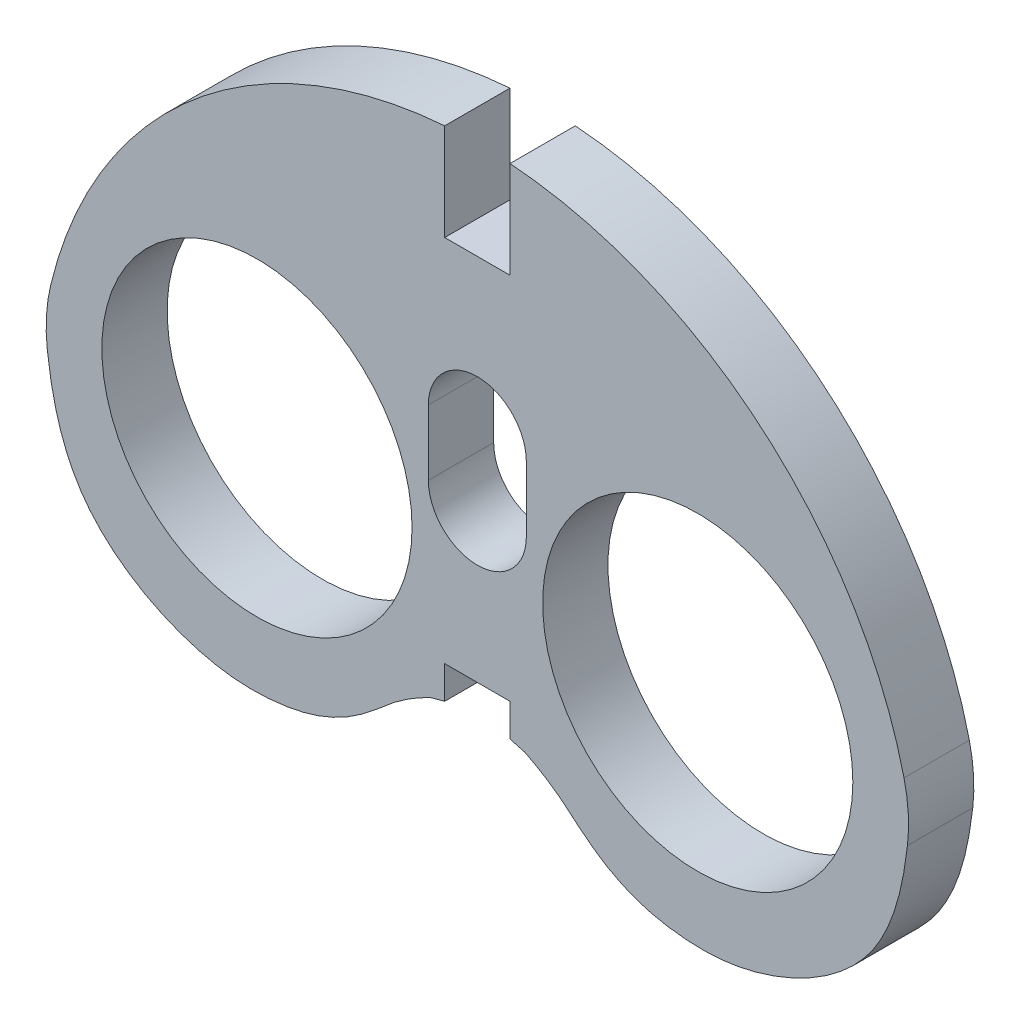
ISO-10303-21;
HEADER;
FILE_DESCRIPTION(('STEP AP214'),'2;1');
FILE_NAME('part.step','',(''),(''),'','','');
FILE_SCHEMA(('AUTOMOTIVE_DESIGN { 1 0 10303 214 1 1 1 1 }'));
ENDSEC;
DATA;
#1=APPLICATION_CONTEXT('core data for automotive mechanical design processes');
#2=APPLICATION_PROTOCOL_DEFINITION('international standard','automotive_design',2000,#1);
#3=PRODUCT_CONTEXT('',#1,'mechanical');
#4=PRODUCT('Part','Part','',(#3));
#5=PRODUCT_RELATED_PRODUCT_CATEGORY('part','',(#4));
#6=PRODUCT_DEFINITION_FORMATION('','',#4);
#7=PRODUCT_DEFINITION_CONTEXT('part definition',#1,'design');
#8=PRODUCT_DEFINITION('design','',#6,#7);
#9=PRODUCT_DEFINITION_SHAPE('','',#8);
#10=(LENGTH_UNIT() NAMED_UNIT(*) SI_UNIT(.MILLI.,.METRE.));
#11=(NAMED_UNIT(*) PLANE_ANGLE_UNIT() SI_UNIT($,.RADIAN.));
#12=(NAMED_UNIT(*) SI_UNIT($,.STERADIAN.) SOLID_ANGLE_UNIT());
#13=UNCERTAINTY_MEASURE_WITH_UNIT(LENGTH_MEASURE(1.E-05),#10,'distance_accuracy_value','');
#14=(GEOMETRIC_REPRESENTATION_CONTEXT(3) GLOBAL_UNCERTAINTY_ASSIGNED_CONTEXT((#13)) GLOBAL_UNIT_ASSIGNED_CONTEXT((#10,
#11,#12)) REPRESENTATION_CONTEXT('',''));
#15=CARTESIAN_POINT('',(0.,0.,0.));
#16=DIRECTION('',(0.,0.,1.));
#17=DIRECTION('',(1.,0.,0.));
#18=AXIS2_PLACEMENT_3D('',#15,#16,#17);
#19=CARTESIAN_POINT('',(16.4115654390647,-0.553695702220483,0.));
#20=DIRECTION('',(0.,0.,-1.));
#21=DIRECTION('',(-1.,0.,0.));
#22=AXIS2_PLACEMENT_3D('',#19,#20,#21);
#23=CYLINDRICAL_SURFACE('',#22,10.);
#24=DIRECTION('',(0.,0.,-1.));
#25=VECTOR('',#24,1.);
#26=CARTESIAN_POINT('',(26.345599961166,-1.70041193289809,0.));
#27=LINE('',#26,#25);
#28=CARTESIAN_POINT('',(26.345599961166,-1.70041193289809,0.));
#29=VERTEX_POINT('',#28);
#30=CARTESIAN_POINT('',(26.345599961166,-1.70041193289809,4.));
#31=VERTEX_POINT('',#30);
#32=EDGE_CURVE('E401',#29,#31,#27,.F.);
#33=ORIENTED_EDGE('',*,*,#32,.F.);
#34=CARTESIAN_POINT('',(16.4115654390647,-0.553695702220483,0.));
#35=DIRECTION('',(0.,0.,1.));
#36=DIRECTION('',(1.,0.,0.));
#37=AXIS2_PLACEMENT_3D('',#34,#35,#36);
#38=CIRCLE('',#37,10.);
#39=CARTESIAN_POINT('',(26.1344253879737,1.78425092118676,0.));
#40=VERTEX_POINT('',#39);
#41=EDGE_CURVE('E43',#40,#29,#38,.F.);
#42=ORIENTED_EDGE('',*,*,#41,.F.);
#43=DIRECTION('',(0.,0.,-1.));
#44=VECTOR('',#43,1.);
#45=CARTESIAN_POINT('',(26.1344253879737,1.78425092118674,4.));
#46=LINE('',#45,#44);
#47=CARTESIAN_POINT('',(26.1344253879737,1.78425092118676,4.));
#48=VERTEX_POINT('',#47);
#49=EDGE_CURVE('E404',#48,#40,#46,.T.);
#50=ORIENTED_EDGE('',*,*,#49,.F.);
#51=CARTESIAN_POINT('',(16.4115654390647,-0.553695702220483,4.));
#52=DIRECTION('',(0.,0.,1.));
#53=DIRECTION('',(1.,0.,0.));
#54=AXIS2_PLACEMENT_3D('',#51,#52,#53);
#55=CIRCLE('',#54,10.);
#56=EDGE_CURVE('E11',#31,#48,#55,.T.);
#57=ORIENTED_EDGE('',*,*,#56,.F.);
#58=EDGE_LOOP('',(#33,#42,#50,#57));
#59=FACE_BOUND('',#58,.T.);
#60=ADVANCED_FACE('F36',(#59),#23,.T.);
#61=CARTESIAN_POINT('',(-16.4115558872511,-0.553655979135895,0.));
#62=DIRECTION('',(0.,0.,-1.));
#63=DIRECTION('',(-1.,0.,0.));
#64=AXIS2_PLACEMENT_3D('',#61,#62,#63);
#65=CYLINDRICAL_SURFACE('',#64,10.);
#66=DIRECTION('',(0.,0.,-1.));
#67=VECTOR('',#66,1.);
#68=CARTESIAN_POINT('',(-26.1344101772882,1.78431417779649,4.));
#69=LINE('',#68,#67);
#70=CARTESIAN_POINT('',(-26.1344101772882,1.78431417779653,0.));
#71=VERTEX_POINT('',#70);
#72=CARTESIAN_POINT('',(-26.1344101772882,1.78431417779653,4.));
#73=VERTEX_POINT('',#72);
#74=EDGE_CURVE('E236',#71,#73,#69,.F.);
#75=ORIENTED_EDGE('',*,*,#74,.F.);
#76=CARTESIAN_POINT('',(-16.4115558872511,-0.553655979135895,0.));
#77=DIRECTION('',(0.,0.,1.));
#78=DIRECTION('',(1.,0.,0.));
#79=AXIS2_PLACEMENT_3D('',#76,#77,#78);
#80=CIRCLE('',#79,10.);
#81=CARTESIAN_POINT('',(-26.3455865208138,-1.70040589582995,0.));
#82=VERTEX_POINT('',#81);
#83=EDGE_CURVE('E239',#82,#71,#80,.F.);
#84=ORIENTED_EDGE('',*,*,#83,.F.);
#85=DIRECTION('',(0.,0.,-1.));
#86=VECTOR('',#85,1.);
#87=CARTESIAN_POINT('',(-26.3455865208138,-1.70040589582995,4.));
#88=LINE('',#87,#86);
#89=CARTESIAN_POINT('',(-26.3455865208138,-1.70040589582995,4.));
#90=VERTEX_POINT('',#89);
#91=EDGE_CURVE('E244',#90,#82,#88,.T.);
#92=ORIENTED_EDGE('',*,*,#91,.F.);
#93=CARTESIAN_POINT('',(-16.4115558872511,-0.553655979135895,4.));
#94=DIRECTION('',(0.,0.,1.));
#95=DIRECTION('',(1.,0.,0.));
#96=AXIS2_PLACEMENT_3D('',#93,#94,#95);
#97=CIRCLE('',#96,10.);
#98=EDGE_CURVE('E241',#73,#90,#97,.T.);
#99=ORIENTED_EDGE('',*,*,#98,.F.);
#100=EDGE_LOOP('',(#75,#84,#92,#99));
#101=FACE_BOUND('',#100,.T.);
#102=ADVANCED_FACE('F207',(#101),#65,.T.);
#103=CARTESIAN_POINT('',(-26.5,0.,4.));
#104=CARTESIAN_POINT('',(-26.2895976855222,-2.99847523002595,4.));
#105=CARTESIAN_POINT('',(-25.2189108157834,-9.88188841737187,4.));
#106=CARTESIAN_POINT('',(-17.2017603669986,-13.6180783087082,4.));
#107=CARTESIAN_POINT('',(-10.4279800743529,-13.4303877120603,4.));
#108=CARTESIAN_POINT('',(-7.34675111448135,-12.0113075123866,4.));
#109=CARTESIAN_POINT('',(-4.70959910667379,-9.37857364414358,4.));
#110=CARTESIAN_POINT('',(-2.891538376648,-8.46449967686823,4.));
#111=B_SPLINE_CURVE_WITH_KNOTS('',3,(#103,#104,#105,#106,#107,#108,#109,#110),.UNSPECIFIED.,.F.,
.F.,(4,1,1,1,1,4),(0.,0.254741044057282,0.56319235685487,0.634676404072125,0.898097469012578,
1.),.UNSPECIFIED.);
#112=DIRECTION('',(0.,0.,-1.));
#113=VECTOR('',#112,1.);
#114=SURFACE_OF_LINEAR_EXTRUSION('',#111,#113);
#115=CARTESIAN_POINT('',(-2.89153837346395,-8.46449967584525,4.));
#116=VERTEX_POINT('',#115);
#117=EDGE_CURVE('E188',#90,#116,#111,.T.);
#118=ORIENTED_EDGE('',*,*,#117,.F.);
#119=ORIENTED_EDGE('',*,*,#91,.T.);
#120=CARTESIAN_POINT('',(-26.5,0.,0.));
#121=CARTESIAN_POINT('',(-26.2895976855222,-2.99847523002595,0.));
#122=CARTESIAN_POINT('',(-25.2189108157834,-9.88188841737187,0.));
#123=CARTESIAN_POINT('',(-17.2017603669986,-13.6180783087082,0.));
#124=CARTESIAN_POINT('',(-10.4279800743529,-13.4303877120603,0.));
#125=CARTESIAN_POINT('',(-7.34675111448135,-12.0113075123866,0.));
#126=CARTESIAN_POINT('',(-4.70959910667379,-9.37857364414358,0.));
#127=CARTESIAN_POINT('',(-2.891538376648,-8.46449967686823,0.));
#128=B_SPLINE_CURVE_WITH_KNOTS('',3,(#120,#121,#122,#123,#124,#125,#126,#127),.UNSPECIFIED.,.F.,
.F.,(4,1,1,1,1,4),(0.,0.254741044057282,0.56319235685487,0.634676404072125,0.898097469012578,
1.),.UNSPECIFIED.);
#129=CARTESIAN_POINT('',(-2.89153837346395,-8.46449967584525,0.));
#130=VERTEX_POINT('',#129);
#131=EDGE_CURVE('E289',#82,#130,#128,.T.);
#132=ORIENTED_EDGE('',*,*,#131,.T.);
#133=DIRECTION('',(0.,0.,-1.));
#134=VECTOR('',#133,1.);
#135=CARTESIAN_POINT('',(-2.89153837346395,-8.46449967584525,4.));
#136=LINE('',#135,#134);
#137=EDGE_CURVE('E245',#116,#130,#136,.T.);
#138=ORIENTED_EDGE('',*,*,#137,.F.);
#139=EDGE_LOOP('',(#118,#119,#132,#138));
#140=FACE_BOUND('',#139,.T.);
#141=ADVANCED_FACE('F202',(#140),#114,.F.);
#142=CARTESIAN_POINT('',(-5.99999999999999,-10.,4.));
#143=CARTESIAN_POINT('',(0.,-6.,4.));
#144=CARTESIAN_POINT('',(6.,-9.99999999999999,4.));
#145=B_SPLINE_CURVE_WITH_KNOTS('',2,(#142,#143,#144),.UNSPECIFIED.,.F.,.F.,(3,3),(0.,1.),.UNSPECIFIED.);
#146=DIRECTION('',(0.,0.,-1.));
#147=VECTOR('',#146,1.);
#148=SURFACE_OF_LINEAR_EXTRUSION('',#145,#147);
#149=CARTESIAN_POINT('',(-5.99999999999999,-10.,0.));
#150=CARTESIAN_POINT('',(0.,-6.,0.));
#151=CARTESIAN_POINT('',(6.,-9.99999999999999,0.));
#152=B_SPLINE_CURVE_WITH_KNOTS('',2,(#149,#150,#151),.UNSPECIFIED.,.F.,.F.,(3,3),(0.,1.),.UNSPECIFIED.);
#153=CARTESIAN_POINT('',(-2.,-8.22222222222222,0.));
#154=VERTEX_POINT('',#153);
#155=EDGE_CURVE('E275',#130,#154,#152,.T.);
#156=ORIENTED_EDGE('',*,*,#155,.T.);
#157=DIRECTION('',(0.,0.,-1.));
#158=VECTOR('',#157,1.);
#159=CARTESIAN_POINT('',(-2.,-8.22222222222222,4.));
#160=LINE('',#159,#158);
#161=CARTESIAN_POINT('',(-2.,-8.22222222222222,4.));
#162=VERTEX_POINT('',#161);
#163=EDGE_CURVE('E389',#162,#154,#160,.T.);
#164=ORIENTED_EDGE('',*,*,#163,.F.);
#165=EDGE_CURVE('E193',#116,#162,#145,.T.);
#166=ORIENTED_EDGE('',*,*,#165,.F.);
#167=ORIENTED_EDGE('',*,*,#137,.T.);
#168=EDGE_LOOP('',(#156,#164,#166,#167));
#169=FACE_BOUND('',#168,.T.);
#170=ADVANCED_FACE('F206',(#169),#148,.F.);
#171=CARTESIAN_POINT('',(-2.,0.,4.));
#172=DIRECTION('',(-1.,0.,0.));
#173=DIRECTION('',(0.,0.,1.));
#174=AXIS2_PLACEMENT_3D('',#171,#172,#173);
#175=PLANE('',#174);
#176=DIRECTION('',(0.,1.,0.));
#177=VECTOR('',#176,1.);
#178=CARTESIAN_POINT('',(-2.,0.,0.));
#179=LINE('',#178,#177);
#180=CARTESIAN_POINT('',(-2.,-6.22222222222222,0.));
#181=VERTEX_POINT('',#180);
#182=EDGE_CURVE('E285',#154,#181,#179,.T.);
#183=ORIENTED_EDGE('',*,*,#182,.T.);
#184=DIRECTION('',(0.,0.,-1.));
#185=VECTOR('',#184,1.);
#186=CARTESIAN_POINT('',(-2.,-6.22222222222222,4.));
#187=LINE('',#186,#185);
#188=CARTESIAN_POINT('',(-2.,-6.22222222222222,4.));
#189=VERTEX_POINT('',#188);
#190=EDGE_CURVE('E370',#189,#181,#187,.T.);
#191=ORIENTED_EDGE('',*,*,#190,.F.);
#192=DIRECTION('',(0.,1.,0.));
#193=VECTOR('',#192,1.);
#194=CARTESIAN_POINT('',(-2.,0.,4.));
#195=LINE('',#194,#193);
#196=EDGE_CURVE('E407',#162,#189,#195,.T.);
#197=ORIENTED_EDGE('',*,*,#196,.F.);
#198=ORIENTED_EDGE('',*,*,#163,.T.);
#199=EDGE_LOOP('',(#183,#191,#197,#198));
#200=FACE_BOUND('',#199,.T.);
#201=ADVANCED_FACE('F209',(#200),#175,.F.);
#202=CARTESIAN_POINT('',(0.,-6.22222222222222,4.));
#203=DIRECTION('',(0.,1.,0.));
#204=DIRECTION('',(0.,0.,1.));
#205=AXIS2_PLACEMENT_3D('',#202,#203,#204);
#206=PLANE('',#205);
#207=DIRECTION('',(1.,0.,0.));
#208=VECTOR('',#207,1.);
#209=CARTESIAN_POINT('',(0.,-6.22222222222222,0.));
#210=LINE('',#209,#208);
#211=CARTESIAN_POINT('',(1.99999999999999,-6.22222222222222,0.));
#212=VERTEX_POINT('',#211);
#213=EDGE_CURVE('E283',#181,#212,#210,.T.);
#214=ORIENTED_EDGE('',*,*,#213,.T.);
#215=DIRECTION('',(0.,0.,-1.));
#216=VECTOR('',#215,1.);
#217=CARTESIAN_POINT('',(1.99999999999999,-6.22222222222222,4.));
#218=LINE('',#217,#216);
#219=CARTESIAN_POINT('',(1.99999999999999,-6.22222222222222,4.));
#220=VERTEX_POINT('',#219);
#221=EDGE_CURVE('E367',#220,#212,#218,.T.);
#222=ORIENTED_EDGE('',*,*,#221,.F.);
#223=DIRECTION('',(1.,0.,0.));
#224=VECTOR('',#223,1.);
#225=CARTESIAN_POINT('',(0.,-6.22222222222222,4.));
#226=LINE('',#225,#224);
#227=EDGE_CURVE('E406',#189,#220,#226,.T.);
#228=ORIENTED_EDGE('',*,*,#227,.F.);
#229=ORIENTED_EDGE('',*,*,#190,.T.);
#230=EDGE_LOOP('',(#214,#222,#228,#229));
#231=FACE_BOUND('',#230,.T.);
#232=ADVANCED_FACE('F354',(#231),#206,.F.);
#233=CARTESIAN_POINT('',(1.99999999999999,0.,4.));
#234=DIRECTION('',(1.,0.,0.));
#235=DIRECTION('',(0.,0.,-1.));
#236=AXIS2_PLACEMENT_3D('',#233,#234,#235);
#237=PLANE('',#236);
#238=DIRECTION('',(0.,-1.,0.));
#239=VECTOR('',#238,1.);
#240=CARTESIAN_POINT('',(1.99999999999999,0.,0.));
#241=LINE('',#240,#239);
#242=CARTESIAN_POINT('',(1.99999999999999,-8.22222222222222,0.));
#243=VERTEX_POINT('',#242);
#244=EDGE_CURVE('E273',#212,#243,#241,.T.);
#245=ORIENTED_EDGE('',*,*,#244,.T.);
#246=DIRECTION('',(0.,0.,-1.));
#247=VECTOR('',#246,1.);
#248=CARTESIAN_POINT('',(1.99999999999999,-8.22222222222222,4.));
#249=LINE('',#248,#247);
#250=CARTESIAN_POINT('',(1.99999999999999,-8.22222222222222,4.));
#251=VERTEX_POINT('',#250);
#252=EDGE_CURVE('E375',#251,#243,#249,.T.);
#253=ORIENTED_EDGE('',*,*,#252,.F.);
#254=DIRECTION('',(0.,-1.,0.));
#255=VECTOR('',#254,1.);
#256=CARTESIAN_POINT('',(1.99999999999999,0.,4.));
#257=LINE('',#256,#255);
#258=EDGE_CURVE('E334',#220,#251,#257,.T.);
#259=ORIENTED_EDGE('',*,*,#258,.F.);
#260=ORIENTED_EDGE('',*,*,#221,.T.);
#261=EDGE_LOOP('',(#245,#253,#259,#260));
#262=FACE_BOUND('',#261,.T.);
#263=ADVANCED_FACE('F351',(#262),#237,.F.);
#264=CARTESIAN_POINT('',(2.90634338283826,-8.46926843660932,0.));
#265=VERTEX_POINT('',#264);
#266=EDGE_CURVE('E268',#243,#265,#152,.T.);
#267=ORIENTED_EDGE('',*,*,#266,.T.);
#268=DIRECTION('',(0.,0.,-1.));
#269=VECTOR('',#268,1.);
#270=CARTESIAN_POINT('',(2.90634338283826,-8.46926843660932,4.));
#271=LINE('',#270,#269);
#272=CARTESIAN_POINT('',(2.90634338283826,-8.46926843660932,4.));
#273=VERTEX_POINT('',#272);
#274=EDGE_CURVE('E381',#273,#265,#271,.T.);
#275=ORIENTED_EDGE('',*,*,#274,.F.);
#276=EDGE_CURVE('E333',#251,#273,#145,.T.);
#277=ORIENTED_EDGE('',*,*,#276,.F.);
#278=ORIENTED_EDGE('',*,*,#252,.T.);
#279=EDGE_LOOP('',(#267,#275,#277,#278));
#280=FACE_BOUND('',#279,.T.);
#281=ADVANCED_FACE('F345',(#280),#148,.F.);
#282=CARTESIAN_POINT('',(26.5,0.,4.));
#283=CARTESIAN_POINT('',(26.2896383228204,-2.99848126423346,4.));
#284=CARTESIAN_POINT('',(25.2188295636254,-9.88187635228887,4.));
#285=CARTESIAN_POINT('',(17.2019466399212,-13.6181059682602,4.));
#286=CARTESIAN_POINT('',(10.4277906663167,-13.4303595869773,4.));
#287=CARTESIAN_POINT('',(7.35013195340265,-12.0118095310831,4.));
#288=CARTESIAN_POINT('',(4.70800394134215,-9.37833677902252,4.));
#289=CARTESIAN_POINT('',(2.89913034709177,-8.46562700389995,4.));
#290=B_SPLINE_CURVE_WITH_KNOTS('',3,(#282,#283,#284,#285,#286,#287,#288,#289),.UNSPECIFIED.,.F.,
.F.,(4,1,1,1,1,4),(0.,0.254741044057282,0.56319235685487,0.634676404072125,0.898097469012578,
1.),.UNSPECIFIED.);
#291=DIRECTION('',(0.,0.,-1.));
#292=VECTOR('',#291,1.);
#293=SURFACE_OF_LINEAR_EXTRUSION('',#290,#292);
#294=CARTESIAN_POINT('',(26.5,0.,0.));
#295=CARTESIAN_POINT('',(26.2896383228204,-2.99848126423346,0.));
#296=CARTESIAN_POINT('',(25.2188295636254,-9.88187635228887,0.));
#297=CARTESIAN_POINT('',(17.2019466399212,-13.6181059682602,0.));
#298=CARTESIAN_POINT('',(10.4277906663167,-13.4303595869773,0.));
#299=CARTESIAN_POINT('',(7.35013195340265,-12.0118095310831,0.));
#300=CARTESIAN_POINT('',(4.70800394134215,-9.37833677902252,0.));
#301=CARTESIAN_POINT('',(2.89913034709177,-8.46562700389995,0.));
#302=B_SPLINE_CURVE_WITH_KNOTS('',3,(#294,#295,#296,#297,#298,#299,#300,#301),.UNSPECIFIED.,.F.,
.F.,(4,1,1,1,1,4),(0.,0.254741044057282,0.56319235685487,0.634676404072125,0.898097469012578,
1.),.UNSPECIFIED.);
#303=EDGE_CURVE('E265',#29,#265,#302,.T.);
#304=ORIENTED_EDGE('',*,*,#303,.F.);
#305=ORIENTED_EDGE('',*,*,#32,.T.);
#306=EDGE_CURVE('E328',#31,#273,#290,.T.);
#307=ORIENTED_EDGE('',*,*,#306,.T.);
#308=ORIENTED_EDGE('',*,*,#274,.T.);
#309=EDGE_LOOP('',(#304,#305,#307,#308));
#310=FACE_BOUND('',#309,.T.);
#311=ADVANCED_FACE('F340',(#310),#293,.T.);
#312=CARTESIAN_POINT('',(0.,-4.5,4.));
#313=DIRECTION('',(0.,0.,-1.));
#314=DIRECTION('',(-1.,0.,0.));
#315=AXIS2_PLACEMENT_3D('',#312,#313,#314);
#316=CYLINDRICAL_SURFACE('',#315,26.8793601114312);
#317=CARTESIAN_POINT('',(0.,-4.5,4.));
#318=DIRECTION('',(0.,0.,1.));
#319=DIRECTION('',(1.,0.,0.));
#320=AXIS2_PLACEMENT_3D('',#317,#318,#319);
#321=CIRCLE('',#320,26.8793601114312);
#322=CARTESIAN_POINT('',(1.99999999999999,22.3048503073604,4.));
#323=VERTEX_POINT('',#322);
#324=EDGE_CURVE('E325',#323,#48,#321,.F.);
#325=ORIENTED_EDGE('',*,*,#324,.T.);
#326=ORIENTED_EDGE('',*,*,#49,.T.);
#327=CARTESIAN_POINT('',(0.,-4.5,0.));
#328=DIRECTION('',(0.,0.,1.));
#329=DIRECTION('',(1.,0.,0.));
#330=AXIS2_PLACEMENT_3D('',#327,#328,#329);
#331=CIRCLE('',#330,26.8793601114312);
#332=CARTESIAN_POINT('',(1.99999999999999,22.3048503073604,0.));
#333=VERTEX_POINT('',#332);
#334=EDGE_CURVE('E256',#333,#40,#331,.F.);
#335=ORIENTED_EDGE('',*,*,#334,.F.);
#336=DIRECTION('',(0.,0.,-1.));
#337=VECTOR('',#336,1.);
#338=CARTESIAN_POINT('',(1.99999999999999,22.3048503073604,4.));
#339=LINE('',#338,#337);
#340=EDGE_CURVE('E384',#323,#333,#339,.T.);
#341=ORIENTED_EDGE('',*,*,#340,.F.);
#342=EDGE_LOOP('',(#325,#326,#335,#341));
#343=FACE_BOUND('',#342,.T.);
#344=ADVANCED_FACE('F344',(#343),#316,.T.);
#345=CARTESIAN_POINT('',(1.99999999999999,0.,4.));
#346=DIRECTION('',(-1.,0.,0.));
#347=DIRECTION('',(0.,-1.,0.));
#348=AXIS2_PLACEMENT_3D('',#345,#346,#347);
#349=PLANE('',#348);
#350=DIRECTION('',(0.,1.,0.));
#351=VECTOR('',#350,1.);
#352=CARTESIAN_POINT('',(1.99999999999999,0.,0.));
#353=LINE('',#352,#351);
#354=CARTESIAN_POINT('',(1.99999999999999,16.3793601114312,0.));
#355=VERTEX_POINT('',#354);
#356=EDGE_CURVE('E264',#355,#333,#353,.T.);
#357=ORIENTED_EDGE('',*,*,#356,.F.);
#358=DIRECTION('',(0.,0.,-1.));
#359=VECTOR('',#358,1.);
#360=CARTESIAN_POINT('',(1.99999999999999,16.3793601114312,4.));
#361=LINE('',#360,#359);
#362=CARTESIAN_POINT('',(1.99999999999999,16.3793601114312,4.));
#363=VERTEX_POINT('',#362);
#364=EDGE_CURVE('E421',#363,#355,#361,.T.);
#365=ORIENTED_EDGE('',*,*,#364,.F.);
#366=DIRECTION('',(0.,1.,0.));
#367=VECTOR('',#366,1.);
#368=CARTESIAN_POINT('',(1.99999999999999,0.,4.));
#369=LINE('',#368,#367);
#370=EDGE_CURVE('E322',#363,#323,#369,.T.);
#371=ORIENTED_EDGE('',*,*,#370,.T.);
#372=ORIENTED_EDGE('',*,*,#340,.T.);
#373=EDGE_LOOP('',(#357,#365,#371,#372));
#374=FACE_BOUND('',#373,.T.);
#375=ADVANCED_FACE('F347',(#374),#349,.T.);
#376=CARTESIAN_POINT('',(0.,16.3793601114312,4.));
#377=DIRECTION('',(0.,1.,0.));
#378=DIRECTION('',(0.,0.,1.));
#379=AXIS2_PLACEMENT_3D('',#376,#377,#378);
#380=PLANE('',#379);
#381=DIRECTION('',(1.,0.,0.));
#382=VECTOR('',#381,1.);
#383=CARTESIAN_POINT('',(0.,16.3793601114312,0.));
#384=LINE('',#383,#382);
#385=CARTESIAN_POINT('',(-2.,16.3793601114312,0.));
#386=VERTEX_POINT('',#385);
#387=EDGE_CURVE('E259',#386,#355,#384,.T.);
#388=ORIENTED_EDGE('',*,*,#387,.F.);
#389=DIRECTION('',(0.,0.,-1.));
#390=VECTOR('',#389,1.);
#391=CARTESIAN_POINT('',(-2.,16.3793601114312,4.));
#392=LINE('',#391,#390);
#393=CARTESIAN_POINT('',(-2.,16.3793601114312,4.));
#394=VERTEX_POINT('',#393);
#395=EDGE_CURVE('E419',#394,#386,#392,.T.);
#396=ORIENTED_EDGE('',*,*,#395,.F.);
#397=DIRECTION('',(1.,0.,0.));
#398=VECTOR('',#397,1.);
#399=CARTESIAN_POINT('',(0.,16.3793601114312,4.));
#400=LINE('',#399,#398);
#401=EDGE_CURVE('E319',#394,#363,#400,.T.);
#402=ORIENTED_EDGE('',*,*,#401,.T.);
#403=ORIENTED_EDGE('',*,*,#364,.T.);
#404=EDGE_LOOP('',(#388,#396,#402,#403));
#405=FACE_BOUND('',#404,.T.);
#406=ADVANCED_FACE('F432',(#405),#380,.T.);
#407=CARTESIAN_POINT('',(-1.99999999999999,0.,4.));
#408=DIRECTION('',(1.,0.,0.));
#409=DIRECTION('',(0.,1.,0.));
#410=AXIS2_PLACEMENT_3D('',#407,#408,#409);
#411=PLANE('',#410);
#412=DIRECTION('',(0.,-1.,0.));
#413=VECTOR('',#412,1.);
#414=CARTESIAN_POINT('',(-1.99999999999999,0.,0.));
#415=LINE('',#414,#413);
#416=CARTESIAN_POINT('',(-2.00000000000001,22.3048503073604,0.));
#417=VERTEX_POINT('',#416);
#418=EDGE_CURVE('E254',#417,#386,#415,.T.);
#419=ORIENTED_EDGE('',*,*,#418,.F.);
#420=DIRECTION('',(0.,0.,-1.));
#421=VECTOR('',#420,1.);
#422=CARTESIAN_POINT('',(-2.00000000000001,22.3048503073604,4.));
#423=LINE('',#422,#421);
#424=CARTESIAN_POINT('',(-2.00000000000001,22.3048503073604,4.));
#425=VERTEX_POINT('',#424);
#426=EDGE_CURVE('E169',#425,#417,#423,.T.);
#427=ORIENTED_EDGE('',*,*,#426,.F.);
#428=DIRECTION('',(0.,-1.,0.));
#429=VECTOR('',#428,1.);
#430=CARTESIAN_POINT('',(-1.99999999999999,0.,4.));
#431=LINE('',#430,#429);
#432=EDGE_CURVE('E316',#425,#394,#431,.T.);
#433=ORIENTED_EDGE('',*,*,#432,.T.);
#434=ORIENTED_EDGE('',*,*,#395,.T.);
#435=EDGE_LOOP('',(#419,#427,#433,#434));
#436=FACE_BOUND('',#435,.T.);
#437=ADVANCED_FACE('F225',(#436),#411,.T.);
#438=CARTESIAN_POINT('',(3.,0.,4.));
#439=DIRECTION('',(-1.,0.,0.));
#440=DIRECTION('',(0.,0.,1.));
#441=AXIS2_PLACEMENT_3D('',#438,#439,#440);
#442=PLANE('',#441);
#443=DIRECTION('',(0.,1.,0.));
#444=VECTOR('',#443,1.);
#445=CARTESIAN_POINT('',(3.,0.,0.));
#446=LINE('',#445,#444);
#447=CARTESIAN_POINT('',(3.,3.,0.));
#448=VERTEX_POINT('',#447);
#449=CARTESIAN_POINT('',(3.,7.,0.));
#450=VERTEX_POINT('',#449);
#451=EDGE_CURVE('E164',#448,#450,#446,.T.);
#452=ORIENTED_EDGE('',*,*,#451,.F.);
#453=DIRECTION('',(0.,0.,-1.));
#454=VECTOR('',#453,1.);
#455=CARTESIAN_POINT('',(3.,3.,4.));
#456=LINE('',#455,#454);
#457=CARTESIAN_POINT('',(3.,3.,4.));
#458=VERTEX_POINT('',#457);
#459=EDGE_CURVE('E158',#458,#448,#456,.T.);
#460=ORIENTED_EDGE('',*,*,#459,.F.);
#461=DIRECTION('',(0.,1.,0.));
#462=VECTOR('',#461,1.);
#463=CARTESIAN_POINT('',(3.,0.,4.));
#464=LINE('',#463,#462);
#465=CARTESIAN_POINT('',(3.,7.,4.));
#466=VERTEX_POINT('',#465);
#467=EDGE_CURVE('E161',#458,#466,#464,.T.);
#468=ORIENTED_EDGE('',*,*,#467,.T.);
#469=DIRECTION('',(0.,0.,-1.));
#470=VECTOR('',#469,1.);
#471=CARTESIAN_POINT('',(3.,7.,4.));
#472=LINE('',#471,#470);
#473=EDGE_CURVE('E314',#466,#450,#472,.T.);
#474=ORIENTED_EDGE('',*,*,#473,.T.);
#475=EDGE_LOOP('',(#452,#460,#468,#474));
#476=FACE_BOUND('',#475,.T.);
#477=ADVANCED_FACE('F160',(#476),#442,.T.);
#478=CARTESIAN_POINT('',(0.,3.,4.));
#479=DIRECTION('',(0.,0.,-1.));
#480=DIRECTION('',(-1.,0.,0.));
#481=AXIS2_PLACEMENT_3D('',#478,#479,#480);
#482=CYLINDRICAL_SURFACE('',#481,3.);
#483=CARTESIAN_POINT('',(0.,3.,0.));
#484=DIRECTION('',(0.,0.,1.));
#485=DIRECTION('',(1.,0.,0.));
#486=AXIS2_PLACEMENT_3D('',#483,#484,#485);
#487=CIRCLE('',#486,3.);
#488=CARTESIAN_POINT('',(-3.,3.,0.));
#489=VERTEX_POINT('',#488);
#490=EDGE_CURVE('E305',#489,#448,#487,.T.);
#491=ORIENTED_EDGE('',*,*,#490,.F.);
#492=DIRECTION('',(0.,0.,-1.));
#493=VECTOR('',#492,1.);
#494=CARTESIAN_POINT('',(-3.,3.,4.));
#495=LINE('',#494,#493);
#496=CARTESIAN_POINT('',(-3.,3.,4.));
#497=VERTEX_POINT('',#496);
#498=EDGE_CURVE('E170',#497,#489,#495,.T.);
#499=ORIENTED_EDGE('',*,*,#498,.F.);
#500=CARTESIAN_POINT('',(0.,3.,4.));
#501=DIRECTION('',(0.,0.,1.));
#502=DIRECTION('',(1.,0.,0.));
#503=AXIS2_PLACEMENT_3D('',#500,#501,#502);
#504=CIRCLE('',#503,3.);
#505=EDGE_CURVE('E175',#497,#458,#504,.T.);
#506=ORIENTED_EDGE('',*,*,#505,.T.);
#507=ORIENTED_EDGE('',*,*,#459,.T.);
#508=EDGE_LOOP('',(#491,#499,#506,#507));
#509=FACE_BOUND('',#508,.T.);
#510=ADVANCED_FACE('F180',(#509),#482,.F.);
#511=CARTESIAN_POINT('',(-3.,0.,4.));
#512=DIRECTION('',(-1.,0.,0.));
#513=DIRECTION('',(0.,0.,1.));
#514=AXIS2_PLACEMENT_3D('',#511,#512,#513);
#515=PLANE('',#514);
#516=DIRECTION('',(0.,1.,0.));
#517=VECTOR('',#516,1.);
#518=CARTESIAN_POINT('',(-3.,0.,0.));
#519=LINE('',#518,#517);
#520=CARTESIAN_POINT('',(-3.,7.,0.));
#521=VERTEX_POINT('',#520);
#522=EDGE_CURVE('E302',#489,#521,#519,.T.);
#523=ORIENTED_EDGE('',*,*,#522,.T.);
#524=DIRECTION('',(0.,0.,-1.));
#525=VECTOR('',#524,1.);
#526=CARTESIAN_POINT('',(-3.,7.,4.));
#527=LINE('',#526,#525);
#528=CARTESIAN_POINT('',(-3.,7.,4.));
#529=VERTEX_POINT('',#528);
#530=EDGE_CURVE('E395',#529,#521,#527,.T.);
#531=ORIENTED_EDGE('',*,*,#530,.F.);
#532=DIRECTION('',(0.,1.,0.));
#533=VECTOR('',#532,1.);
#534=CARTESIAN_POINT('',(-3.,0.,4.));
#535=LINE('',#534,#533);
#536=EDGE_CURVE('E182',#497,#529,#535,.T.);
#537=ORIENTED_EDGE('',*,*,#536,.F.);
#538=ORIENTED_EDGE('',*,*,#498,.T.);
#539=EDGE_LOOP('',(#523,#531,#537,#538));
#540=FACE_BOUND('',#539,.T.);
#541=ADVANCED_FACE('F217',(#540),#515,.F.);
#542=EDGE_CURVE('E248',#71,#417,#331,.F.);
#543=ORIENTED_EDGE('',*,*,#542,.F.);
#544=ORIENTED_EDGE('',*,*,#74,.T.);
#545=EDGE_CURVE('E315',#73,#425,#321,.F.);
#546=ORIENTED_EDGE('',*,*,#545,.T.);
#547=ORIENTED_EDGE('',*,*,#426,.T.);
#548=EDGE_LOOP('',(#543,#544,#546,#547));
#549=FACE_BOUND('',#548,.T.);
#550=ADVANCED_FACE('F215',(#549),#316,.T.);
#551=CARTESIAN_POINT('',(0.,7.,4.));
#552=DIRECTION('',(0.,0.,-1.));
#553=DIRECTION('',(-1.,0.,0.));
#554=AXIS2_PLACEMENT_3D('',#551,#552,#553);
#555=CYLINDRICAL_SURFACE('',#554,3.);
#556=CARTESIAN_POINT('',(0.,7.,0.));
#557=DIRECTION('',(0.,0.,1.));
#558=DIRECTION('',(1.,0.,0.));
#559=AXIS2_PLACEMENT_3D('',#556,#557,#558);
#560=CIRCLE('',#559,3.);
#561=EDGE_CURVE('E296',#450,#521,#560,.T.);
#562=ORIENTED_EDGE('',*,*,#561,.F.);
#563=ORIENTED_EDGE('',*,*,#473,.F.);
#564=CARTESIAN_POINT('',(0.,7.,4.));
#565=DIRECTION('',(0.,0.,1.));
#566=DIRECTION('',(1.,0.,0.));
#567=AXIS2_PLACEMENT_3D('',#564,#565,#566);
#568=CIRCLE('',#567,3.);
#569=EDGE_CURVE('E177',#466,#529,#568,.T.);
#570=ORIENTED_EDGE('',*,*,#569,.T.);
#571=ORIENTED_EDGE('',*,*,#530,.T.);
#572=EDGE_LOOP('',(#562,#563,#570,#571));
#573=FACE_BOUND('',#572,.T.);
#574=ADVANCED_FACE('F211',(#573),#555,.F.);
#575=CARTESIAN_POINT('',(13.5,0.,4.));
#576=DIRECTION('',(0.,0.,-1.));
#577=DIRECTION('',(-1.,0.,0.));
#578=AXIS2_PLACEMENT_3D('',#575,#576,#577);
#579=CYLINDRICAL_SURFACE('',#578,9.5);
#580=CARTESIAN_POINT('',(13.5,0.,4.));
#581=DIRECTION('',(0.,0.,1.));
#582=DIRECTION('',(1.,0.,0.));
#583=AXIS2_PLACEMENT_3D('',#580,#581,#582);
#584=CIRCLE('',#583,9.5);
#585=CARTESIAN_POINT('',(23.,0.,4.));
#586=VERTEX_POINT('',#585);
#587=EDGE_CURVE('E178',#586,#586,#584,.T.);
#588=ORIENTED_EDGE('',*,*,#587,.T.);
#589=EDGE_LOOP('',(#588));
#590=FACE_BOUND('',#589,.T.);
#591=CARTESIAN_POINT('',(13.5,0.,0.));
#592=DIRECTION('',(0.,0.,1.));
#593=DIRECTION('',(1.,0.,0.));
#594=AXIS2_PLACEMENT_3D('',#591,#592,#593);
#595=CIRCLE('',#594,9.5);
#596=CARTESIAN_POINT('',(23.,0.,0.));
#597=VERTEX_POINT('',#596);
#598=EDGE_CURVE('E308',#597,#597,#595,.T.);
#599=ORIENTED_EDGE('',*,*,#598,.F.);
#600=EDGE_LOOP('',(#599));
#601=FACE_BOUND('',#600,.T.);
#602=ADVANCED_FACE('F214',(#590,#601),#579,.F.);
#603=CARTESIAN_POINT('',(-13.5,0.,4.));
#604=DIRECTION('',(0.,0.,-1.));
#605=DIRECTION('',(-1.,0.,0.));
#606=AXIS2_PLACEMENT_3D('',#603,#604,#605);
#607=CYLINDRICAL_SURFACE('',#606,9.5);
#608=CARTESIAN_POINT('',(-13.5,0.,4.));
#609=DIRECTION('',(0.,0.,1.));
#610=DIRECTION('',(1.,0.,0.));
#611=AXIS2_PLACEMENT_3D('',#608,#609,#610);
#612=CIRCLE('',#611,9.5);
#613=CARTESIAN_POINT('',(-4.,0.,4.));
#614=VERTEX_POINT('',#613);
#615=EDGE_CURVE('E311',#614,#614,#612,.T.);
#616=ORIENTED_EDGE('',*,*,#615,.T.);
#617=EDGE_LOOP('',(#616));
#618=FACE_BOUND('',#617,.T.);
#619=CARTESIAN_POINT('',(-13.5,0.,0.));
#620=DIRECTION('',(0.,0.,1.));
#621=DIRECTION('',(1.,0.,0.));
#622=AXIS2_PLACEMENT_3D('',#619,#620,#621);
#623=CIRCLE('',#622,9.5);
#624=CARTESIAN_POINT('',(-4.,0.,0.));
#625=VERTEX_POINT('',#624);
#626=EDGE_CURVE('E253',#625,#625,#623,.T.);
#627=ORIENTED_EDGE('',*,*,#626,.F.);
#628=EDGE_LOOP('',(#627));
#629=FACE_BOUND('',#628,.T.);
#630=ADVANCED_FACE('F227',(#618,#629),#607,.F.);
#631=CARTESIAN_POINT('',(0.,0.,4.));
#632=DIRECTION('',(0.,0.,1.));
#633=DIRECTION('',(1.,0.,0.));
#634=AXIS2_PLACEMENT_3D('',#631,#632,#633);
#635=PLANE('',#634);
#636=ORIENTED_EDGE('',*,*,#587,.F.);
#637=EDGE_LOOP('',(#636));
#638=FACE_BOUND('',#637,.T.);
#639=ORIENTED_EDGE('',*,*,#467,.F.);
#640=ORIENTED_EDGE('',*,*,#505,.F.);
#641=ORIENTED_EDGE('',*,*,#536,.T.);
#642=ORIENTED_EDGE('',*,*,#569,.F.);
#643=EDGE_LOOP('',(#639,#640,#641,#642));
#644=FACE_BOUND('',#643,.T.);
#645=ORIENTED_EDGE('',*,*,#306,.F.);
#646=ORIENTED_EDGE('',*,*,#56,.T.);
#647=ORIENTED_EDGE('',*,*,#324,.F.);
#648=ORIENTED_EDGE('',*,*,#370,.F.);
#649=ORIENTED_EDGE('',*,*,#401,.F.);
#650=ORIENTED_EDGE('',*,*,#432,.F.);
#651=ORIENTED_EDGE('',*,*,#545,.F.);
#652=ORIENTED_EDGE('',*,*,#98,.T.);
#653=ORIENTED_EDGE('',*,*,#117,.T.);
#654=ORIENTED_EDGE('',*,*,#165,.T.);
#655=ORIENTED_EDGE('',*,*,#196,.T.);
#656=ORIENTED_EDGE('',*,*,#227,.T.);
#657=ORIENTED_EDGE('',*,*,#258,.T.);
#658=ORIENTED_EDGE('',*,*,#276,.T.);
#659=EDGE_LOOP('',(#645,#646,#647,#648,#649,#650,#651,#652,#653,#654,#655,#656,#657,#658));
#660=FACE_BOUND('',#659,.T.);
#661=ORIENTED_EDGE('',*,*,#615,.F.);
#662=EDGE_LOOP('',(#661));
#663=FACE_BOUND('',#662,.T.);
#664=ADVANCED_FACE('F174',(#638,#644,#660,#663),#635,.T.);
#665=CARTESIAN_POINT('',(0.,0.,0.));
#666=DIRECTION('',(0.,0.,1.));
#667=DIRECTION('',(1.,0.,0.));
#668=AXIS2_PLACEMENT_3D('',#665,#666,#667);
#669=PLANE('',#668);
#670=ORIENTED_EDGE('',*,*,#598,.T.);
#671=EDGE_LOOP('',(#670));
#672=FACE_BOUND('',#671,.T.);
#673=ORIENTED_EDGE('',*,*,#451,.T.);
#674=ORIENTED_EDGE('',*,*,#561,.T.);
#675=ORIENTED_EDGE('',*,*,#522,.F.);
#676=ORIENTED_EDGE('',*,*,#490,.T.);
#677=EDGE_LOOP('',(#673,#674,#675,#676));
#678=FACE_BOUND('',#677,.T.);
#679=ORIENTED_EDGE('',*,*,#334,.T.);
#680=ORIENTED_EDGE('',*,*,#41,.T.);
#681=ORIENTED_EDGE('',*,*,#303,.T.);
#682=ORIENTED_EDGE('',*,*,#266,.F.);
#683=ORIENTED_EDGE('',*,*,#244,.F.);
#684=ORIENTED_EDGE('',*,*,#213,.F.);
#685=ORIENTED_EDGE('',*,*,#182,.F.);
#686=ORIENTED_EDGE('',*,*,#155,.F.);
#687=ORIENTED_EDGE('',*,*,#131,.F.);
#688=ORIENTED_EDGE('',*,*,#83,.T.);
#689=ORIENTED_EDGE('',*,*,#542,.T.);
#690=ORIENTED_EDGE('',*,*,#418,.T.);
#691=ORIENTED_EDGE('',*,*,#387,.T.);
#692=ORIENTED_EDGE('',*,*,#356,.T.);
#693=EDGE_LOOP('',(#679,#680,#681,#682,#683,#684,#685,#686,#687,#688,#689,#690,#691,#692));
#694=FACE_BOUND('',#693,.T.);
#695=ORIENTED_EDGE('',*,*,#626,.T.);
#696=EDGE_LOOP('',(#695));
#697=FACE_BOUND('',#696,.T.);
#698=ADVANCED_FACE('F377',(#672,#678,#694,#697),#669,.F.);
#699=CLOSED_SHELL('',(#60,#102,#141,#170,#201,#232,#263,#281,#311,#344,#375,#406,#437,#477,#510,
#541,#550,#574,#602,#630,#664,#698));
#700=MANIFOLD_SOLID_BREP('B2',#699);
#701=ADVANCED_BREP_SHAPE_REPRESENTATION('',(#18,#700),#14);
#702=SHAPE_DEFINITION_REPRESENTATION(#9,#701);
ENDSEC;
END-ISO-10303-21;
